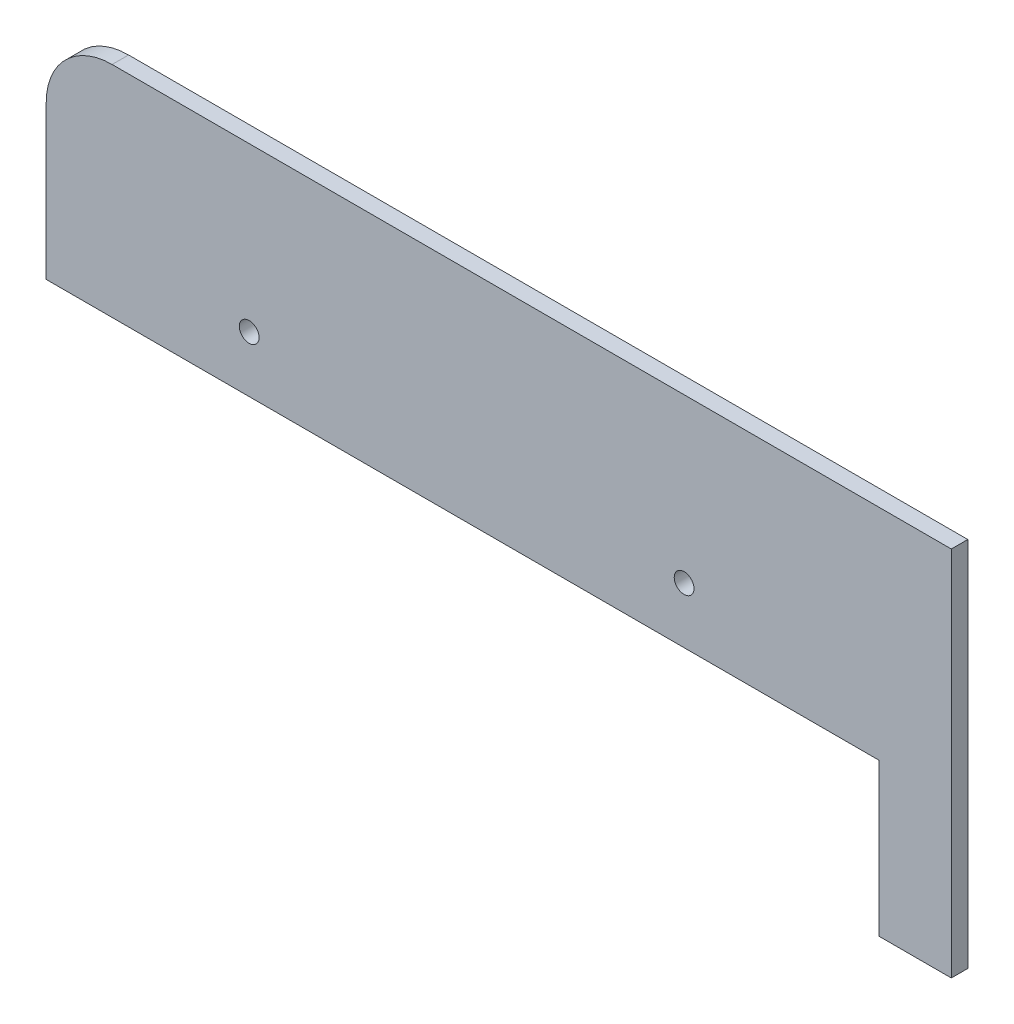
ISO-10303-21;
HEADER;
FILE_DESCRIPTION(('STEP AP214'),'2;1');
FILE_NAME('part.step','',(''),(''),'','','');
FILE_SCHEMA(('AUTOMOTIVE_DESIGN { 1 0 10303 214 1 1 1 1 }'));
ENDSEC;
DATA;
#1=APPLICATION_CONTEXT('core data for automotive mechanical design processes');
#2=APPLICATION_PROTOCOL_DEFINITION('international standard','automotive_design',2000,#1);
#3=PRODUCT_CONTEXT('',#1,'mechanical');
#4=PRODUCT('Part','Part','',(#3));
#5=PRODUCT_RELATED_PRODUCT_CATEGORY('part','',(#4));
#6=PRODUCT_DEFINITION_FORMATION('','',#4);
#7=PRODUCT_DEFINITION_CONTEXT('part definition',#1,'design');
#8=PRODUCT_DEFINITION('design','',#6,#7);
#9=PRODUCT_DEFINITION_SHAPE('','',#8);
#10=(LENGTH_UNIT() NAMED_UNIT(*) SI_UNIT(.MILLI.,.METRE.));
#11=(NAMED_UNIT(*) PLANE_ANGLE_UNIT() SI_UNIT($,.RADIAN.));
#12=(NAMED_UNIT(*) SI_UNIT($,.STERADIAN.) SOLID_ANGLE_UNIT());
#13=UNCERTAINTY_MEASURE_WITH_UNIT(LENGTH_MEASURE(1.E-05),#10,'distance_accuracy_value','');
#14=(GEOMETRIC_REPRESENTATION_CONTEXT(3) GLOBAL_UNCERTAINTY_ASSIGNED_CONTEXT((#13)) GLOBAL_UNIT_ASSIGNED_CONTEXT((#10,
#11,#12)) REPRESENTATION_CONTEXT('',''));
#15=CARTESIAN_POINT('',(0.,0.,0.));
#16=DIRECTION('',(0.,0.,1.));
#17=DIRECTION('',(1.,0.,0.));
#18=AXIS2_PLACEMENT_3D('',#15,#16,#17);
#19=CARTESIAN_POINT('',(-67.4022435897436,38.8605769230769,2.5));
#20=DIRECTION('',(0.,-1.,0.));
#21=DIRECTION('',(0.,0.,-1.));
#22=AXIS2_PLACEMENT_3D('',#19,#20,#21);
#23=PLANE('',#22);
#24=DIRECTION('',(-1.,0.,0.));
#25=VECTOR('',#24,1.);
#26=CARTESIAN_POINT('',(-67.4022435897436,38.8605769230769,0.));
#27=LINE('',#26,#25);
#28=CARTESIAN_POINT('',(67.9477564102564,38.8605769230769,0.));
#29=VERTEX_POINT('',#28);
#30=CARTESIAN_POINT('',(-59.4022435897436,38.8605769230769,0.));
#31=VERTEX_POINT('',#30);
#32=EDGE_CURVE('E144',#29,#31,#27,.T.);
#33=ORIENTED_EDGE('',*,*,#32,.T.);
#34=DIRECTION('',(0.,0.,-1.));
#35=VECTOR('',#34,1.);
#36=CARTESIAN_POINT('',(-59.4022435897436,38.8605769230769,2.5));
#37=LINE('',#36,#35);
#38=CARTESIAN_POINT('',(-59.4022435897436,38.8605769230769,2.5));
#39=VERTEX_POINT('',#38);
#40=EDGE_CURVE('E51',#31,#39,#37,.F.);
#41=ORIENTED_EDGE('',*,*,#40,.T.);
#42=DIRECTION('',(-1.,0.,0.));
#43=VECTOR('',#42,1.);
#44=CARTESIAN_POINT('',(-67.4022435897436,38.8605769230769,2.5));
#45=LINE('',#44,#43);
#46=CARTESIAN_POINT('',(67.9477564102564,38.8605769230769,2.5));
#47=VERTEX_POINT('',#46);
#48=EDGE_CURVE('E145',#47,#39,#45,.T.);
#49=ORIENTED_EDGE('',*,*,#48,.F.);
#50=DIRECTION('',(0.,0.,-1.));
#51=VECTOR('',#50,1.);
#52=CARTESIAN_POINT('',(67.9477564102564,38.8605769230769,2.5));
#53=LINE('',#52,#51);
#54=EDGE_CURVE('E154',#47,#29,#53,.T.);
#55=ORIENTED_EDGE('',*,*,#54,.T.);
#56=EDGE_LOOP('',(#33,#41,#49,#55));
#57=FACE_BOUND('',#56,.T.);
#58=ADVANCED_FACE('F43',(#57),#23,.F.);
#59=CARTESIAN_POINT('',(56.9377564102564,4.61057692307693,2.5));
#60=DIRECTION('',(1.,0.,0.));
#61=DIRECTION('',(0.,0.,-1.));
#62=AXIS2_PLACEMENT_3D('',#59,#60,#61);
#63=PLANE('',#62);
#64=DIRECTION('',(0.,-1.,0.));
#65=VECTOR('',#64,1.);
#66=CARTESIAN_POINT('',(56.9377564102564,4.61057692307693,0.));
#67=LINE('',#66,#65);
#68=CARTESIAN_POINT('',(56.9377564102564,5.61057692307693,0.));
#69=VERTEX_POINT('',#68);
#70=CARTESIAN_POINT('',(56.9377564102564,-17.5194230769231,0.));
#71=VERTEX_POINT('',#70);
#72=EDGE_CURVE('E117',#69,#71,#67,.T.);
#73=ORIENTED_EDGE('',*,*,#72,.T.);
#74=DIRECTION('',(0.,0.,-1.));
#75=VECTOR('',#74,1.);
#76=CARTESIAN_POINT('',(56.9377564102564,-17.5194230769231,2.5));
#77=LINE('',#76,#75);
#78=CARTESIAN_POINT('',(56.9377564102564,-17.5194230769231,2.5));
#79=VERTEX_POINT('',#78);
#80=EDGE_CURVE('E165',#79,#71,#77,.T.);
#81=ORIENTED_EDGE('',*,*,#80,.F.);
#82=DIRECTION('',(0.,-1.,0.));
#83=VECTOR('',#82,1.);
#84=CARTESIAN_POINT('',(56.9377564102564,4.61057692307693,2.5));
#85=LINE('',#84,#83);
#86=CARTESIAN_POINT('',(56.9377564102564,5.61057692307693,2.5));
#87=VERTEX_POINT('',#86);
#88=EDGE_CURVE('E147',#87,#79,#85,.T.);
#89=ORIENTED_EDGE('',*,*,#88,.F.);
#90=DIRECTION('',(0.,0.,1.));
#91=VECTOR('',#90,1.);
#92=CARTESIAN_POINT('',(56.9377564102564,5.61057692307693,0.));
#93=LINE('',#92,#91);
#94=EDGE_CURVE('E121',#69,#87,#93,.T.);
#95=ORIENTED_EDGE('',*,*,#94,.F.);
#96=EDGE_LOOP('',(#73,#81,#89,#95));
#97=FACE_BOUND('',#96,.T.);
#98=ADVANCED_FACE('F190',(#97),#63,.F.);
#99=CARTESIAN_POINT('',(56.9377564102564,-17.5194230769231,2.5));
#100=DIRECTION('',(0.,1.,0.));
#101=DIRECTION('',(0.,0.,1.));
#102=AXIS2_PLACEMENT_3D('',#99,#100,#101);
#103=PLANE('',#102);
#104=DIRECTION('',(1.,0.,0.));
#105=VECTOR('',#104,1.);
#106=CARTESIAN_POINT('',(56.9377564102564,-17.5194230769231,0.));
#107=LINE('',#106,#105);
#108=CARTESIAN_POINT('',(67.9477564102564,-17.5194230769231,0.));
#109=VERTEX_POINT('',#108);
#110=EDGE_CURVE('E157',#71,#109,#107,.T.);
#111=ORIENTED_EDGE('',*,*,#110,.T.);
#112=DIRECTION('',(0.,0.,-1.));
#113=VECTOR('',#112,1.);
#114=CARTESIAN_POINT('',(67.9477564102564,-17.5194230769231,2.5));
#115=LINE('',#114,#113);
#116=CARTESIAN_POINT('',(67.9477564102564,-17.5194230769231,2.5));
#117=VERTEX_POINT('',#116);
#118=EDGE_CURVE('E162',#117,#109,#115,.T.);
#119=ORIENTED_EDGE('',*,*,#118,.F.);
#120=DIRECTION('',(1.,0.,0.));
#121=VECTOR('',#120,1.);
#122=CARTESIAN_POINT('',(56.9377564102564,-17.5194230769231,2.5));
#123=LINE('',#122,#121);
#124=EDGE_CURVE('E150',#79,#117,#123,.T.);
#125=ORIENTED_EDGE('',*,*,#124,.F.);
#126=ORIENTED_EDGE('',*,*,#80,.T.);
#127=EDGE_LOOP('',(#111,#119,#125,#126));
#128=FACE_BOUND('',#127,.T.);
#129=ADVANCED_FACE('F172',(#128),#103,.F.);
#130=CARTESIAN_POINT('',(67.9477564102564,38.8605769230769,2.5));
#131=DIRECTION('',(-1.,0.,0.));
#132=DIRECTION('',(0.,-1.,0.));
#133=AXIS2_PLACEMENT_3D('',#130,#131,#132);
#134=PLANE('',#133);
#135=DIRECTION('',(0.,1.,0.));
#136=VECTOR('',#135,1.);
#137=CARTESIAN_POINT('',(67.9477564102564,38.8605769230769,0.));
#138=LINE('',#137,#136);
#139=EDGE_CURVE('E148',#109,#29,#138,.T.);
#140=ORIENTED_EDGE('',*,*,#139,.T.);
#141=ORIENTED_EDGE('',*,*,#54,.F.);
#142=DIRECTION('',(0.,1.,0.));
#143=VECTOR('',#142,1.);
#144=CARTESIAN_POINT('',(67.9477564102564,38.8605769230769,2.5));
#145=LINE('',#144,#143);
#146=EDGE_CURVE('E152',#117,#47,#145,.T.);
#147=ORIENTED_EDGE('',*,*,#146,.F.);
#148=ORIENTED_EDGE('',*,*,#118,.T.);
#149=EDGE_LOOP('',(#140,#141,#147,#148));
#150=FACE_BOUND('',#149,.T.);
#151=ADVANCED_FACE('F178',(#150),#134,.F.);
#152=CARTESIAN_POINT('',(0.,0.,2.5));
#153=DIRECTION('',(0.,0.,-1.));
#154=DIRECTION('',(-1.,0.,0.));
#155=AXIS2_PLACEMENT_3D('',#152,#153,#154);
#156=PLANE('',#155);
#157=CARTESIAN_POINT('',(27.3990681649394,14.1105769230769,2.5));
#158=DIRECTION('',(0.,0.,-1.));
#159=DIRECTION('',(-1.,0.,0.));
#160=AXIS2_PLACEMENT_3D('',#157,#158,#159);
#161=CIRCLE('',#160,1.5);
#162=CARTESIAN_POINT('',(25.8990681649394,14.1105769230769,2.5));
#163=VERTEX_POINT('',#162);
#164=EDGE_CURVE('E141',#163,#163,#161,.T.);
#165=ORIENTED_EDGE('',*,*,#164,.T.);
#166=EDGE_LOOP('',(#165));
#167=FACE_BOUND('',#166,.T.);
#168=CARTESIAN_POINT('',(-38.6009318350606,14.1105769230769,2.5));
#169=DIRECTION('',(0.,0.,-1.));
#170=DIRECTION('',(-1.,0.,0.));
#171=AXIS2_PLACEMENT_3D('',#168,#169,#170);
#172=CIRCLE('',#171,1.5);
#173=CARTESIAN_POINT('',(-40.1009318350606,14.1105769230769,2.5));
#174=VERTEX_POINT('',#173);
#175=EDGE_CURVE('E136',#174,#174,#172,.T.);
#176=ORIENTED_EDGE('',*,*,#175,.T.);
#177=EDGE_LOOP('',(#176));
#178=FACE_BOUND('',#177,.T.);
#179=ORIENTED_EDGE('',*,*,#48,.T.);
#180=CARTESIAN_POINT('',(-59.4022435897436,28.8605769230769,2.5));
#181=DIRECTION('',(0.,0.,-1.));
#182=DIRECTION('',(-1.,0.,0.));
#183=AXIS2_PLACEMENT_3D('',#180,#181,#182);
#184=CIRCLE('',#183,10.);
#185=CARTESIAN_POINT('',(-69.4022435897436,28.8605769230769,2.5));
#186=VERTEX_POINT('',#185);
#187=EDGE_CURVE('E11',#39,#186,#184,.F.);
#188=ORIENTED_EDGE('',*,*,#187,.T.);
#189=DIRECTION('',(0.,1.,0.));
#190=VECTOR('',#189,1.);
#191=CARTESIAN_POINT('',(-69.4022435897436,5.61057692307693,2.5));
#192=LINE('',#191,#190);
#193=CARTESIAN_POINT('',(-69.4022435897436,5.61057692307693,2.5));
#194=VERTEX_POINT('',#193);
#195=EDGE_CURVE('E122',#194,#186,#192,.T.);
#196=ORIENTED_EDGE('',*,*,#195,.F.);
#197=DIRECTION('',(-1.,0.,0.));
#198=VECTOR('',#197,1.);
#199=CARTESIAN_POINT('',(56.9377564102564,5.61057692307693,2.5));
#200=LINE('',#199,#198);
#201=EDGE_CURVE('E126',#87,#194,#200,.T.);
#202=ORIENTED_EDGE('',*,*,#201,.F.);
#203=ORIENTED_EDGE('',*,*,#88,.T.);
#204=ORIENTED_EDGE('',*,*,#124,.T.);
#205=ORIENTED_EDGE('',*,*,#146,.T.);
#206=EDGE_LOOP('',(#179,#188,#196,#202,#203,#204,#205));
#207=FACE_BOUND('',#206,.T.);
#208=ADVANCED_FACE('F182',(#167,#178,#207),#156,.F.);
#209=CARTESIAN_POINT('',(0.,0.,0.));
#210=DIRECTION('',(0.,0.,-1.));
#211=DIRECTION('',(-1.,0.,0.));
#212=AXIS2_PLACEMENT_3D('',#209,#210,#211);
#213=PLANE('',#212);
#214=DIRECTION('',(0.,-1.,0.));
#215=VECTOR('',#214,1.);
#216=CARTESIAN_POINT('',(-69.4022435897436,38.8605769230769,0.));
#217=LINE('',#216,#215);
#218=CARTESIAN_POINT('',(-69.4022435897436,28.8605769230769,0.));
#219=VERTEX_POINT('',#218);
#220=CARTESIAN_POINT('',(-69.4022435897436,5.61057692307693,0.));
#221=VERTEX_POINT('',#220);
#222=EDGE_CURVE('E102',#219,#221,#217,.T.);
#223=ORIENTED_EDGE('',*,*,#222,.F.);
#224=CARTESIAN_POINT('',(-59.4022435897436,28.8605769230769,0.));
#225=DIRECTION('',(0.,0.,-1.));
#226=DIRECTION('',(-1.,0.,0.));
#227=AXIS2_PLACEMENT_3D('',#224,#225,#226);
#228=CIRCLE('',#227,10.);
#229=EDGE_CURVE('E65',#219,#31,#228,.T.);
#230=ORIENTED_EDGE('',*,*,#229,.T.);
#231=ORIENTED_EDGE('',*,*,#32,.F.);
#232=ORIENTED_EDGE('',*,*,#139,.F.);
#233=ORIENTED_EDGE('',*,*,#110,.F.);
#234=ORIENTED_EDGE('',*,*,#72,.F.);
#235=DIRECTION('',(1.,0.,0.));
#236=VECTOR('',#235,1.);
#237=CARTESIAN_POINT('',(-67.4022435897436,5.61057692307693,0.));
#238=LINE('',#237,#236);
#239=EDGE_CURVE('E113',#221,#69,#238,.T.);
#240=ORIENTED_EDGE('',*,*,#239,.F.);
#241=EDGE_LOOP('',(#223,#230,#231,#232,#233,#234,#240));
#242=FACE_BOUND('',#241,.T.);
#243=CARTESIAN_POINT('',(27.3990681649394,14.1105769230769,0.));
#244=DIRECTION('',(0.,0.,-1.));
#245=DIRECTION('',(-1.,0.,0.));
#246=AXIS2_PLACEMENT_3D('',#243,#244,#245);
#247=CIRCLE('',#246,1.5);
#248=CARTESIAN_POINT('',(25.8990681649394,14.1105769230769,0.));
#249=VERTEX_POINT('',#248);
#250=EDGE_CURVE('E133',#249,#249,#247,.T.);
#251=ORIENTED_EDGE('',*,*,#250,.F.);
#252=EDGE_LOOP('',(#251));
#253=FACE_BOUND('',#252,.T.);
#254=CARTESIAN_POINT('',(-38.6009318350606,14.1105769230769,0.));
#255=DIRECTION('',(0.,0.,-1.));
#256=DIRECTION('',(-1.,0.,0.));
#257=AXIS2_PLACEMENT_3D('',#254,#255,#256);
#258=CIRCLE('',#257,1.5);
#259=CARTESIAN_POINT('',(-40.1009318350606,14.1105769230769,0.));
#260=VERTEX_POINT('',#259);
#261=EDGE_CURVE('E132',#260,#260,#258,.T.);
#262=ORIENTED_EDGE('',*,*,#261,.F.);
#263=EDGE_LOOP('',(#262));
#264=FACE_BOUND('',#263,.T.);
#265=ADVANCED_FACE('F114',(#242,#253,#264),#213,.T.);
#266=CARTESIAN_POINT('',(-38.6009318350606,14.1105769230769,10.));
#267=DIRECTION('',(0.,0.,-1.));
#268=DIRECTION('',(-1.,0.,0.));
#269=AXIS2_PLACEMENT_3D('',#266,#267,#268);
#270=CYLINDRICAL_SURFACE('',#269,1.5);
#271=ORIENTED_EDGE('',*,*,#261,.T.);
#272=EDGE_LOOP('',(#271));
#273=FACE_BOUND('',#272,.T.);
#274=ORIENTED_EDGE('',*,*,#175,.F.);
#275=EDGE_LOOP('',(#274));
#276=FACE_BOUND('',#275,.T.);
#277=ADVANCED_FACE('F202',(#273,#276),#270,.F.);
#278=CARTESIAN_POINT('',(27.3990681649394,14.1105769230769,10.));
#279=DIRECTION('',(0.,0.,-1.));
#280=DIRECTION('',(-1.,0.,0.));
#281=AXIS2_PLACEMENT_3D('',#278,#279,#280);
#282=CYLINDRICAL_SURFACE('',#281,1.5);
#283=ORIENTED_EDGE('',*,*,#250,.T.);
#284=EDGE_LOOP('',(#283));
#285=FACE_BOUND('',#284,.T.);
#286=ORIENTED_EDGE('',*,*,#164,.F.);
#287=EDGE_LOOP('',(#286));
#288=FACE_BOUND('',#287,.T.);
#289=ADVANCED_FACE('F208',(#285,#288),#282,.F.);
#290=CARTESIAN_POINT('',(0.,5.61057692307693,0.));
#291=DIRECTION('',(0.,-1.,0.));
#292=DIRECTION('',(0.,0.,-1.));
#293=AXIS2_PLACEMENT_3D('',#290,#291,#292);
#294=PLANE('',#293);
#295=ORIENTED_EDGE('',*,*,#201,.T.);
#296=DIRECTION('',(0.,0.,1.));
#297=VECTOR('',#296,1.);
#298=CARTESIAN_POINT('',(-69.4022435897436,5.61057692307693,0.));
#299=LINE('',#298,#297);
#300=EDGE_CURVE('E107',#221,#194,#299,.T.);
#301=ORIENTED_EDGE('',*,*,#300,.F.);
#302=ORIENTED_EDGE('',*,*,#239,.T.);
#303=ORIENTED_EDGE('',*,*,#94,.T.);
#304=EDGE_LOOP('',(#295,#301,#302,#303));
#305=FACE_BOUND('',#304,.T.);
#306=ADVANCED_FACE('F124',(#305),#294,.T.);
#307=CARTESIAN_POINT('',(-69.4022435897436,0.,0.));
#308=DIRECTION('',(-1.,0.,0.));
#309=DIRECTION('',(0.,0.,1.));
#310=AXIS2_PLACEMENT_3D('',#307,#308,#309);
#311=PLANE('',#310);
#312=ORIENTED_EDGE('',*,*,#195,.T.);
#313=DIRECTION('',(0.,0.,-1.));
#314=VECTOR('',#313,1.);
#315=CARTESIAN_POINT('',(-69.4022435897436,28.8605769230769,0.));
#316=LINE('',#315,#314);
#317=EDGE_CURVE('E110',#186,#219,#316,.T.);
#318=ORIENTED_EDGE('',*,*,#317,.T.);
#319=ORIENTED_EDGE('',*,*,#222,.T.);
#320=ORIENTED_EDGE('',*,*,#300,.T.);
#321=EDGE_LOOP('',(#312,#318,#319,#320));
#322=FACE_BOUND('',#321,.T.);
#323=ADVANCED_FACE('F105',(#322),#311,.T.);
#324=CARTESIAN_POINT('',(-59.4022435897436,28.8605769230769,0.));
#325=DIRECTION('',(0.,0.,1.));
#326=DIRECTION('',(1.,0.,0.));
#327=AXIS2_PLACEMENT_3D('',#324,#325,#326);
#328=CYLINDRICAL_SURFACE('',#327,10.);
#329=ORIENTED_EDGE('',*,*,#187,.F.);
#330=ORIENTED_EDGE('',*,*,#40,.F.);
#331=ORIENTED_EDGE('',*,*,#229,.F.);
#332=ORIENTED_EDGE('',*,*,#317,.F.);
#333=EDGE_LOOP('',(#329,#330,#331,#332));
#334=FACE_BOUND('',#333,.T.);
#335=ADVANCED_FACE('F45',(#334),#328,.T.);
#336=CLOSED_SHELL('',(#58,#98,#129,#151,#208,#265,#277,#289,#306,#323,#335));
#337=MANIFOLD_SOLID_BREP('B2',#336);
#338=ADVANCED_BREP_SHAPE_REPRESENTATION('',(#18,#337),#14);
#339=SHAPE_DEFINITION_REPRESENTATION(#9,#338);
ENDSEC;
END-ISO-10303-21;
